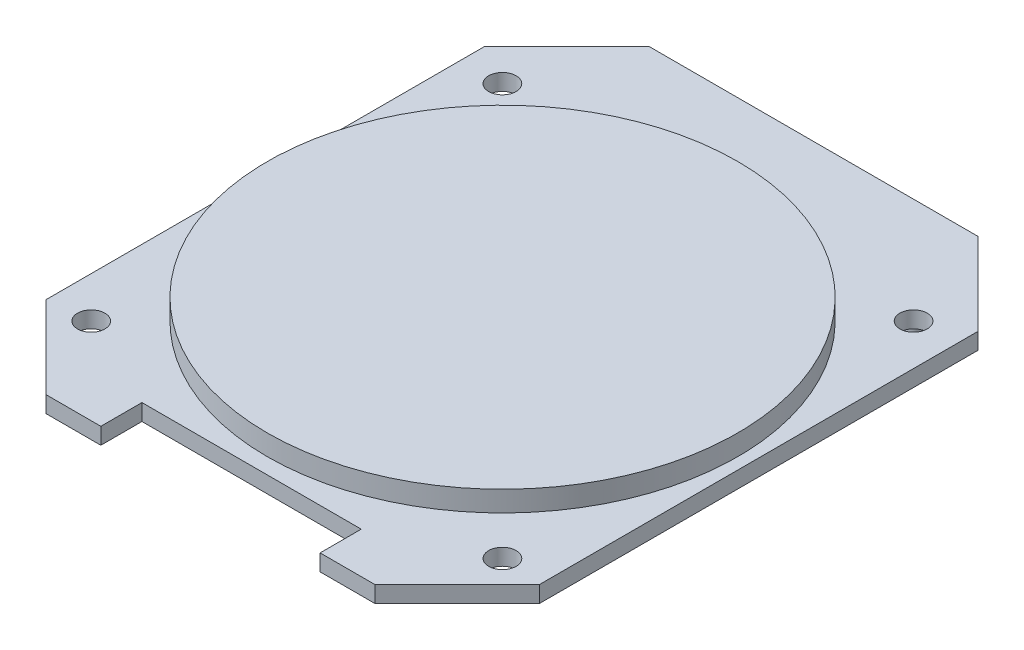
ISO-10303-21;
HEADER;
FILE_DESCRIPTION(('STEP AP214'),'2;1');
FILE_NAME('part.step','',(''),(''),'','','');
FILE_SCHEMA(('AUTOMOTIVE_DESIGN { 1 0 10303 214 1 1 1 1 }'));
ENDSEC;
DATA;
#1=APPLICATION_CONTEXT('core data for automotive mechanical design processes');
#2=APPLICATION_PROTOCOL_DEFINITION('international standard','automotive_design',2000,#1);
#3=PRODUCT_CONTEXT('',#1,'mechanical');
#4=PRODUCT('Part','Part','',(#3));
#5=PRODUCT_RELATED_PRODUCT_CATEGORY('part','',(#4));
#6=PRODUCT_DEFINITION_FORMATION('','',#4);
#7=PRODUCT_DEFINITION_CONTEXT('part definition',#1,'design');
#8=PRODUCT_DEFINITION('design','',#6,#7);
#9=PRODUCT_DEFINITION_SHAPE('','',#8);
#10=(LENGTH_UNIT() NAMED_UNIT(*) SI_UNIT(.MILLI.,.METRE.));
#11=(NAMED_UNIT(*) PLANE_ANGLE_UNIT() SI_UNIT($,.RADIAN.));
#12=(NAMED_UNIT(*) SI_UNIT($,.STERADIAN.) SOLID_ANGLE_UNIT());
#13=UNCERTAINTY_MEASURE_WITH_UNIT(LENGTH_MEASURE(1.E-05),#10,'distance_accuracy_value','');
#14=(GEOMETRIC_REPRESENTATION_CONTEXT(3) GLOBAL_UNCERTAINTY_ASSIGNED_CONTEXT((#13)) GLOBAL_UNIT_ASSIGNED_CONTEXT((#10,
#11,#12)) REPRESENTATION_CONTEXT('',''));
#15=CARTESIAN_POINT('',(0.,0.,0.));
#16=DIRECTION('',(0.,0.,1.));
#17=DIRECTION('',(1.,0.,0.));
#18=AXIS2_PLACEMENT_3D('',#15,#16,#17);
#19=CARTESIAN_POINT('',(0.,0.,0.));
#20=DIRECTION('',(0.,-1.,0.));
#21=DIRECTION('',(0.,0.,-1.));
#22=AXIS2_PLACEMENT_3D('',#19,#20,#21);
#23=PLANE('',#22);
#24=CARTESIAN_POINT('',(-15.,0.,-6.3));
#25=DIRECTION('',(0.,1.,0.));
#26=DIRECTION('',(0.,0.,-1.));
#27=AXIS2_PLACEMENT_3D('',#24,#25,#26);
#28=CIRCLE('',#27,1.00000000000001);
#29=CARTESIAN_POINT('',(-15.,0.,-7.30000000000001));
#30=VERTEX_POINT('',#29);
#31=EDGE_CURVE('E240',#30,#30,#28,.T.);
#32=ORIENTED_EDGE('',*,*,#31,.T.);
#33=EDGE_LOOP('',(#32));
#34=FACE_BOUND('',#33,.T.);
#35=CARTESIAN_POINT('',(15.,0.,-6.3));
#36=DIRECTION('',(0.,1.,0.));
#37=DIRECTION('',(0.,0.,1.));
#38=AXIS2_PLACEMENT_3D('',#35,#36,#37);
#39=CIRCLE('',#38,1.00000000000001);
#40=CARTESIAN_POINT('',(15.,0.,-5.29999999999999));
#41=VERTEX_POINT('',#40);
#42=EDGE_CURVE('E252',#41,#41,#39,.T.);
#43=ORIENTED_EDGE('',*,*,#42,.T.);
#44=EDGE_LOOP('',(#43));
#45=FACE_BOUND('',#44,.T.);
#46=CARTESIAN_POINT('',(15.,0.,-36.3));
#47=DIRECTION('',(0.,1.,0.));
#48=DIRECTION('',(0.,0.,-1.));
#49=AXIS2_PLACEMENT_3D('',#46,#47,#48);
#50=CIRCLE('',#49,1.00000000000001);
#51=CARTESIAN_POINT('',(15.,0.,-37.3));
#52=VERTEX_POINT('',#51);
#53=EDGE_CURVE('E246',#52,#52,#50,.T.);
#54=ORIENTED_EDGE('',*,*,#53,.T.);
#55=EDGE_LOOP('',(#54));
#56=FACE_BOUND('',#55,.T.);
#57=CARTESIAN_POINT('',(-15.,0.,-36.3));
#58=DIRECTION('',(0.,1.,0.));
#59=DIRECTION('',(0.,0.,1.));
#60=AXIS2_PLACEMENT_3D('',#57,#58,#59);
#61=CIRCLE('',#60,1.00000000000001);
#62=CARTESIAN_POINT('',(-15.,0.,-35.3));
#63=VERTEX_POINT('',#62);
#64=EDGE_CURVE('E231',#63,#63,#61,.T.);
#65=ORIENTED_EDGE('',*,*,#64,.T.);
#66=EDGE_LOOP('',(#65));
#67=FACE_BOUND('',#66,.T.);
#68=DIRECTION('',(-1.,0.,0.));
#69=VECTOR('',#68,1.);
#70=CARTESIAN_POINT('',(6.,0.,-28.));
#71=LINE('',#70,#69);
#72=CARTESIAN_POINT('',(6.,0.,-28.));
#73=VERTEX_POINT('',#72);
#74=CARTESIAN_POINT('',(-6.,0.,-28.));
#75=VERTEX_POINT('',#74);
#76=EDGE_CURVE('E199',#73,#75,#71,.T.);
#77=ORIENTED_EDGE('',*,*,#76,.F.);
#78=DIRECTION('',(0.,0.,1.));
#79=VECTOR('',#78,1.);
#80=CARTESIAN_POINT('',(6.,0.,-32.5));
#81=LINE('',#80,#79);
#82=CARTESIAN_POINT('',(6.,0.,-32.5));
#83=VERTEX_POINT('',#82);
#84=EDGE_CURVE('E196',#83,#73,#81,.T.);
#85=ORIENTED_EDGE('',*,*,#84,.F.);
#86=DIRECTION('',(1.,0.,0.));
#87=VECTOR('',#86,1.);
#88=CARTESIAN_POINT('',(6.,0.,-32.5));
#89=LINE('',#88,#87);
#90=CARTESIAN_POINT('',(-6.,0.,-32.5));
#91=VERTEX_POINT('',#90);
#92=EDGE_CURVE('E209',#91,#83,#89,.T.);
#93=ORIENTED_EDGE('',*,*,#92,.F.);
#94=DIRECTION('',(0.,0.,-1.));
#95=VECTOR('',#94,1.);
#96=CARTESIAN_POINT('',(-6.,0.,-32.5));
#97=LINE('',#96,#95);
#98=EDGE_CURVE('E217',#75,#91,#97,.T.);
#99=ORIENTED_EDGE('',*,*,#98,.F.);
#100=EDGE_LOOP('',(#77,#85,#93,#99));
#101=FACE_BOUND('',#100,.T.);
#102=DIRECTION('',(-1.,0.,0.));
#103=VECTOR('',#102,1.);
#104=CARTESIAN_POINT('',(-12.,0.,-44.));
#105=LINE('',#104,#103);
#106=CARTESIAN_POINT('',(-11.43,0.,-44.));
#107=VERTEX_POINT('',#106);
#108=CARTESIAN_POINT('',(-12.,0.,-44.));
#109=VERTEX_POINT('',#108);
#110=EDGE_CURVE('E290',#107,#109,#105,.T.);
#111=ORIENTED_EDGE('',*,*,#110,.F.);
#112=DIRECTION('',(0.,0.,-1.));
#113=VECTOR('',#112,1.);
#114=CARTESIAN_POINT('',(-11.43,0.,-44.));
#115=LINE('',#114,#113);
#116=CARTESIAN_POINT('',(-11.43,0.,-41.46));
#117=VERTEX_POINT('',#116);
#118=EDGE_CURVE('E463',#117,#107,#115,.T.);
#119=ORIENTED_EDGE('',*,*,#118,.F.);
#120=DIRECTION('',(-1.,0.,0.));
#121=VECTOR('',#120,1.);
#122=CARTESIAN_POINT('',(11.43,0.,-41.46));
#123=LINE('',#122,#121);
#124=CARTESIAN_POINT('',(11.43,0.,-41.46));
#125=VERTEX_POINT('',#124);
#126=EDGE_CURVE('E194',#125,#117,#123,.T.);
#127=ORIENTED_EDGE('',*,*,#126,.F.);
#128=DIRECTION('',(0.,0.,1.));
#129=VECTOR('',#128,1.);
#130=CARTESIAN_POINT('',(11.43,0.,-44.));
#131=LINE('',#130,#129);
#132=CARTESIAN_POINT('',(11.43,0.,-44.));
#133=VERTEX_POINT('',#132);
#134=EDGE_CURVE('E190',#133,#125,#131,.T.);
#135=ORIENTED_EDGE('',*,*,#134,.F.);
#136=CARTESIAN_POINT('',(12.,0.,-44.));
#137=VERTEX_POINT('',#136);
#138=EDGE_CURVE('E291',#137,#133,#105,.T.);
#139=ORIENTED_EDGE('',*,*,#138,.F.);
#140=DIRECTION('',(-0.707106781186544,0.,-0.707106781186551));
#141=VECTOR('',#140,1.);
#142=CARTESIAN_POINT('',(12.,0.,-44.));
#143=LINE('',#142,#141);
#144=CARTESIAN_POINT('',(18.,0.,-37.9999999999999));
#145=VERTEX_POINT('',#144);
#146=EDGE_CURVE('E258',#145,#137,#143,.T.);
#147=ORIENTED_EDGE('',*,*,#146,.F.);
#148=DIRECTION('',(0.,0.,-1.));
#149=VECTOR('',#148,1.);
#150=CARTESIAN_POINT('',(18.,0.,-37.9999999999999));
#151=LINE('',#150,#149);
#152=CARTESIAN_POINT('',(18.,0.,-6.00000000000006));
#153=VERTEX_POINT('',#152);
#154=EDGE_CURVE('E265',#153,#145,#151,.T.);
#155=ORIENTED_EDGE('',*,*,#154,.F.);
#156=DIRECTION('',(0.707106781186544,0.,-0.707106781186551));
#157=VECTOR('',#156,1.);
#158=CARTESIAN_POINT('',(18.,0.,-6.00000000000006));
#159=LINE('',#158,#157);
#160=CARTESIAN_POINT('',(12.,0.,0.));
#161=VERTEX_POINT('',#160);
#162=EDGE_CURVE('E310',#161,#153,#159,.T.);
#163=ORIENTED_EDGE('',*,*,#162,.F.);
#164=DIRECTION('',(1.,0.,0.));
#165=VECTOR('',#164,1.);
#166=CARTESIAN_POINT('',(12.,0.,0.));
#167=LINE('',#166,#165);
#168=CARTESIAN_POINT('',(8.,0.,0.));
#169=VERTEX_POINT('',#168);
#170=EDGE_CURVE('E308',#169,#161,#167,.T.);
#171=ORIENTED_EDGE('',*,*,#170,.F.);
#172=DIRECTION('',(0.,0.,1.));
#173=VECTOR('',#172,1.);
#174=CARTESIAN_POINT('',(8.,0.,0.));
#175=LINE('',#174,#173);
#176=CARTESIAN_POINT('',(8.,0.,-3.));
#177=VERTEX_POINT('',#176);
#178=EDGE_CURVE('E306',#177,#169,#175,.T.);
#179=ORIENTED_EDGE('',*,*,#178,.F.);
#180=DIRECTION('',(1.,0.,0.));
#181=VECTOR('',#180,1.);
#182=CARTESIAN_POINT('',(8.,0.,-3.));
#183=LINE('',#182,#181);
#184=CARTESIAN_POINT('',(-8.,0.,-3.));
#185=VERTEX_POINT('',#184);
#186=EDGE_CURVE('E304',#185,#177,#183,.T.);
#187=ORIENTED_EDGE('',*,*,#186,.F.);
#188=DIRECTION('',(0.,0.,-1.));
#189=VECTOR('',#188,1.);
#190=CARTESIAN_POINT('',(-8.,0.,0.));
#191=LINE('',#190,#189);
#192=CARTESIAN_POINT('',(-8.,0.,0.));
#193=VERTEX_POINT('',#192);
#194=EDGE_CURVE('E302',#193,#185,#191,.T.);
#195=ORIENTED_EDGE('',*,*,#194,.F.);
#196=DIRECTION('',(1.,0.,0.));
#197=VECTOR('',#196,1.);
#198=CARTESIAN_POINT('',(-12.,0.,0.));
#199=LINE('',#198,#197);
#200=CARTESIAN_POINT('',(-12.,0.,0.));
#201=VERTEX_POINT('',#200);
#202=EDGE_CURVE('E300',#201,#193,#199,.T.);
#203=ORIENTED_EDGE('',*,*,#202,.F.);
#204=DIRECTION('',(0.707106781186544,0.,0.707106781186551));
#205=VECTOR('',#204,1.);
#206=CARTESIAN_POINT('',(-18.,0.,-6.00000000000007));
#207=LINE('',#206,#205);
#208=CARTESIAN_POINT('',(-18.,0.,-6.00000000000007));
#209=VERTEX_POINT('',#208);
#210=EDGE_CURVE('E298',#209,#201,#207,.T.);
#211=ORIENTED_EDGE('',*,*,#210,.F.);
#212=DIRECTION('',(0.,0.,1.));
#213=VECTOR('',#212,1.);
#214=CARTESIAN_POINT('',(-18.,0.,-37.9999999999999));
#215=LINE('',#214,#213);
#216=CARTESIAN_POINT('',(-18.,0.,-37.9999999999999));
#217=VERTEX_POINT('',#216);
#218=EDGE_CURVE('E296',#217,#209,#215,.T.);
#219=ORIENTED_EDGE('',*,*,#218,.F.);
#220=DIRECTION('',(-0.707106781186544,0.,0.707106781186551));
#221=VECTOR('',#220,1.);
#222=CARTESIAN_POINT('',(-12.,0.,-44.));
#223=LINE('',#222,#221);
#224=EDGE_CURVE('E294',#109,#217,#223,.T.);
#225=ORIENTED_EDGE('',*,*,#224,.F.);
#226=EDGE_LOOP('',(#111,#119,#127,#135,#139,#147,#155,#163,#171,#179,#187,#195,#203,#211,#219,#225));
#227=FACE_BOUND('',#226,.T.);
#228=ADVANCED_FACE('F36',(#34,#45,#56,#67,#101,#227),#23,.T.);
#229=CARTESIAN_POINT('',(0.,1.2,0.));
#230=DIRECTION('',(0.,-1.,0.));
#231=DIRECTION('',(0.,0.,-1.));
#232=AXIS2_PLACEMENT_3D('',#229,#230,#231);
#233=PLANE('',#232);
#234=CARTESIAN_POINT('',(0.,1.2,-21.31));
#235=DIRECTION('',(0.,1.,0.));
#236=DIRECTION('',(0.,0.,1.));
#237=AXIS2_PLACEMENT_3D('',#234,#235,#236);
#238=CIRCLE('',#237,17.16);
#239=CARTESIAN_POINT('',(0.,1.2,-4.14999999999999));
#240=VERTEX_POINT('',#239);
#241=EDGE_CURVE('E232',#240,#240,#238,.T.);
#242=ORIENTED_EDGE('',*,*,#241,.F.);
#243=EDGE_LOOP('',(#242));
#244=FACE_BOUND('',#243,.T.);
#245=DIRECTION('',(-0.707106781186544,0.,-0.707106781186551));
#246=VECTOR('',#245,1.);
#247=CARTESIAN_POINT('',(12.,1.2,-44.));
#248=LINE('',#247,#246);
#249=CARTESIAN_POINT('',(18.,1.2,-37.9999999999999));
#250=VERTEX_POINT('',#249);
#251=CARTESIAN_POINT('',(12.,1.2,-44.));
#252=VERTEX_POINT('',#251);
#253=EDGE_CURVE('E261',#250,#252,#248,.T.);
#254=ORIENTED_EDGE('',*,*,#253,.T.);
#255=DIRECTION('',(-1.,0.,0.));
#256=VECTOR('',#255,1.);
#257=CARTESIAN_POINT('',(-12.,1.2,-44.));
#258=LINE('',#257,#256);
#259=CARTESIAN_POINT('',(-12.,1.2,-44.));
#260=VERTEX_POINT('',#259);
#261=EDGE_CURVE('E264',#252,#260,#258,.T.);
#262=ORIENTED_EDGE('',*,*,#261,.T.);
#263=DIRECTION('',(-0.707106781186544,0.,0.707106781186551));
#264=VECTOR('',#263,1.);
#265=CARTESIAN_POINT('',(-12.,1.2,-44.));
#266=LINE('',#265,#264);
#267=CARTESIAN_POINT('',(-18.,1.2,-37.9999999999999));
#268=VERTEX_POINT('',#267);
#269=EDGE_CURVE('E267',#260,#268,#266,.T.);
#270=ORIENTED_EDGE('',*,*,#269,.T.);
#271=DIRECTION('',(0.,0.,1.));
#272=VECTOR('',#271,1.);
#273=CARTESIAN_POINT('',(-18.,1.2,-37.9999999999999));
#274=LINE('',#273,#272);
#275=CARTESIAN_POINT('',(-18.,1.2,-6.00000000000007));
#276=VERTEX_POINT('',#275);
#277=EDGE_CURVE('E269',#268,#276,#274,.T.);
#278=ORIENTED_EDGE('',*,*,#277,.T.);
#279=DIRECTION('',(0.707106781186544,0.,0.707106781186551));
#280=VECTOR('',#279,1.);
#281=CARTESIAN_POINT('',(-18.,1.2,-6.00000000000007));
#282=LINE('',#281,#280);
#283=CARTESIAN_POINT('',(-12.,1.2,0.));
#284=VERTEX_POINT('',#283);
#285=EDGE_CURVE('E271',#276,#284,#282,.T.);
#286=ORIENTED_EDGE('',*,*,#285,.T.);
#287=DIRECTION('',(1.,0.,0.));
#288=VECTOR('',#287,1.);
#289=CARTESIAN_POINT('',(-12.,1.2,0.));
#290=LINE('',#289,#288);
#291=CARTESIAN_POINT('',(-8.,1.2,0.));
#292=VERTEX_POINT('',#291);
#293=EDGE_CURVE('E273',#284,#292,#290,.T.);
#294=ORIENTED_EDGE('',*,*,#293,.T.);
#295=DIRECTION('',(0.,0.,-1.));
#296=VECTOR('',#295,1.);
#297=CARTESIAN_POINT('',(-8.,1.2,0.));
#298=LINE('',#297,#296);
#299=CARTESIAN_POINT('',(-8.,1.2,-3.));
#300=VERTEX_POINT('',#299);
#301=EDGE_CURVE('E275',#292,#300,#298,.T.);
#302=ORIENTED_EDGE('',*,*,#301,.T.);
#303=DIRECTION('',(1.,0.,0.));
#304=VECTOR('',#303,1.);
#305=CARTESIAN_POINT('',(8.,1.2,-3.));
#306=LINE('',#305,#304);
#307=CARTESIAN_POINT('',(8.,1.2,-3.));
#308=VERTEX_POINT('',#307);
#309=EDGE_CURVE('E277',#300,#308,#306,.T.);
#310=ORIENTED_EDGE('',*,*,#309,.T.);
#311=DIRECTION('',(0.,0.,1.));
#312=VECTOR('',#311,1.);
#313=CARTESIAN_POINT('',(8.,1.2,0.));
#314=LINE('',#313,#312);
#315=CARTESIAN_POINT('',(8.,1.2,0.));
#316=VERTEX_POINT('',#315);
#317=EDGE_CURVE('E279',#308,#316,#314,.T.);
#318=ORIENTED_EDGE('',*,*,#317,.T.);
#319=DIRECTION('',(1.,0.,0.));
#320=VECTOR('',#319,1.);
#321=CARTESIAN_POINT('',(12.,1.2,0.));
#322=LINE('',#321,#320);
#323=CARTESIAN_POINT('',(12.,1.2,0.));
#324=VERTEX_POINT('',#323);
#325=EDGE_CURVE('E281',#316,#324,#322,.T.);
#326=ORIENTED_EDGE('',*,*,#325,.T.);
#327=DIRECTION('',(0.707106781186544,0.,-0.707106781186551));
#328=VECTOR('',#327,1.);
#329=CARTESIAN_POINT('',(18.,1.2,-6.00000000000006));
#330=LINE('',#329,#328);
#331=CARTESIAN_POINT('',(18.,1.2,-6.00000000000006));
#332=VERTEX_POINT('',#331);
#333=EDGE_CURVE('E283',#324,#332,#330,.T.);
#334=ORIENTED_EDGE('',*,*,#333,.T.);
#335=DIRECTION('',(0.,0.,-1.));
#336=VECTOR('',#335,1.);
#337=CARTESIAN_POINT('',(18.,1.2,-37.9999999999999));
#338=LINE('',#337,#336);
#339=EDGE_CURVE('E285',#332,#250,#338,.T.);
#340=ORIENTED_EDGE('',*,*,#339,.T.);
#341=EDGE_LOOP('',(#254,#262,#270,#278,#286,#294,#302,#310,#318,#326,#334,#340));
#342=FACE_BOUND('',#341,.T.);
#343=CARTESIAN_POINT('',(15.,1.2,-6.3));
#344=DIRECTION('',(0.,1.,0.));
#345=DIRECTION('',(0.,0.,1.));
#346=AXIS2_PLACEMENT_3D('',#343,#344,#345);
#347=CIRCLE('',#346,1.00000000000001);
#348=CARTESIAN_POINT('',(15.,1.2,-5.29999999999999));
#349=VERTEX_POINT('',#348);
#350=EDGE_CURVE('E255',#349,#349,#347,.T.);
#351=ORIENTED_EDGE('',*,*,#350,.F.);
#352=EDGE_LOOP('',(#351));
#353=FACE_BOUND('',#352,.T.);
#354=CARTESIAN_POINT('',(15.,1.2,-36.3));
#355=DIRECTION('',(0.,1.,0.));
#356=DIRECTION('',(0.,0.,-1.));
#357=AXIS2_PLACEMENT_3D('',#354,#355,#356);
#358=CIRCLE('',#357,1.00000000000001);
#359=CARTESIAN_POINT('',(15.,1.2,-37.3));
#360=VERTEX_POINT('',#359);
#361=EDGE_CURVE('E249',#360,#360,#358,.T.);
#362=ORIENTED_EDGE('',*,*,#361,.F.);
#363=EDGE_LOOP('',(#362));
#364=FACE_BOUND('',#363,.T.);
#365=CARTESIAN_POINT('',(-15.,1.2,-6.3));
#366=DIRECTION('',(0.,1.,0.));
#367=DIRECTION('',(0.,0.,-1.));
#368=AXIS2_PLACEMENT_3D('',#365,#366,#367);
#369=CIRCLE('',#368,1.00000000000001);
#370=CARTESIAN_POINT('',(-15.,1.2,-7.30000000000001));
#371=VERTEX_POINT('',#370);
#372=EDGE_CURVE('E243',#371,#371,#369,.T.);
#373=ORIENTED_EDGE('',*,*,#372,.F.);
#374=EDGE_LOOP('',(#373));
#375=FACE_BOUND('',#374,.T.);
#376=CARTESIAN_POINT('',(-15.,1.2,-36.3));
#377=DIRECTION('',(0.,1.,0.));
#378=DIRECTION('',(0.,0.,1.));
#379=AXIS2_PLACEMENT_3D('',#376,#377,#378);
#380=CIRCLE('',#379,1.00000000000001);
#381=CARTESIAN_POINT('',(-15.,1.2,-35.3));
#382=VERTEX_POINT('',#381);
#383=EDGE_CURVE('E237',#382,#382,#380,.T.);
#384=ORIENTED_EDGE('',*,*,#383,.F.);
#385=EDGE_LOOP('',(#384));
#386=FACE_BOUND('',#385,.T.);
#387=ADVANCED_FACE('F398',(#244,#342,#353,#364,#375,#386),#233,.F.);
#388=CARTESIAN_POINT('',(12.,1.2,-44.));
#389=DIRECTION('',(-0.707106781186551,0.,0.707106781186544));
#390=DIRECTION('',(0.707106781186544,0.,0.707106781186551));
#391=AXIS2_PLACEMENT_3D('',#388,#389,#390);
#392=PLANE('',#391);
#393=ORIENTED_EDGE('',*,*,#146,.T.);
#394=DIRECTION('',(0.,-1.,0.));
#395=VECTOR('',#394,1.);
#396=CARTESIAN_POINT('',(12.,1.2,-44.));
#397=LINE('',#396,#395);
#398=EDGE_CURVE('E236',#252,#137,#397,.T.);
#399=ORIENTED_EDGE('',*,*,#398,.F.);
#400=ORIENTED_EDGE('',*,*,#253,.F.);
#401=DIRECTION('',(0.,-1.,0.));
#402=VECTOR('',#401,1.);
#403=CARTESIAN_POINT('',(18.,1.2,-37.9999999999999));
#404=LINE('',#403,#402);
#405=EDGE_CURVE('E287',#250,#145,#404,.T.);
#406=ORIENTED_EDGE('',*,*,#405,.T.);
#407=EDGE_LOOP('',(#393,#399,#400,#406));
#408=FACE_BOUND('',#407,.T.);
#409=ADVANCED_FACE('F38',(#408),#392,.F.);
#410=CARTESIAN_POINT('',(-12.,1.2,-44.));
#411=DIRECTION('',(0.,0.,1.));
#412=DIRECTION('',(1.,0.,0.));
#413=AXIS2_PLACEMENT_3D('',#410,#411,#412);
#414=PLANE('',#413);
#415=ORIENTED_EDGE('',*,*,#138,.T.);
#416=DIRECTION('',(0.,1.,0.));
#417=VECTOR('',#416,1.);
#418=CARTESIAN_POINT('',(11.43,-2.,-44.));
#419=LINE('',#418,#417);
#420=CARTESIAN_POINT('',(11.43,-2.,-44.));
#421=VERTEX_POINT('',#420);
#422=EDGE_CURVE('E201',#421,#133,#419,.T.);
#423=ORIENTED_EDGE('',*,*,#422,.F.);
#424=DIRECTION('',(1.,0.,0.));
#425=VECTOR('',#424,1.);
#426=CARTESIAN_POINT('',(11.43,-2.,-44.));
#427=LINE('',#426,#425);
#428=CARTESIAN_POINT('',(-11.43,-2.,-44.));
#429=VERTEX_POINT('',#428);
#430=EDGE_CURVE('E180',#429,#421,#427,.T.);
#431=ORIENTED_EDGE('',*,*,#430,.F.);
#432=DIRECTION('',(0.,1.,0.));
#433=VECTOR('',#432,1.);
#434=CARTESIAN_POINT('',(-11.43,-2.,-44.));
#435=LINE('',#434,#433);
#436=EDGE_CURVE('E51',#429,#107,#435,.T.);
#437=ORIENTED_EDGE('',*,*,#436,.T.);
#438=ORIENTED_EDGE('',*,*,#110,.T.);
#439=DIRECTION('',(0.,-1.,0.));
#440=VECTOR('',#439,1.);
#441=CARTESIAN_POINT('',(-12.,1.2,-44.));
#442=LINE('',#441,#440);
#443=EDGE_CURVE('E342',#260,#109,#442,.T.);
#444=ORIENTED_EDGE('',*,*,#443,.F.);
#445=ORIENTED_EDGE('',*,*,#261,.F.);
#446=ORIENTED_EDGE('',*,*,#398,.T.);
#447=EDGE_LOOP('',(#415,#423,#431,#437,#438,#444,#445,#446));
#448=FACE_BOUND('',#447,.T.);
#449=ADVANCED_FACE('F448',(#448),#414,.F.);
#450=CARTESIAN_POINT('',(-12.,1.2,-44.));
#451=DIRECTION('',(0.707106781186551,0.,0.707106781186544));
#452=DIRECTION('',(0.707106781186544,0.,-0.707106781186551));
#453=AXIS2_PLACEMENT_3D('',#450,#451,#452);
#454=PLANE('',#453);
#455=ORIENTED_EDGE('',*,*,#224,.T.);
#456=DIRECTION('',(0.,-1.,0.));
#457=VECTOR('',#456,1.);
#458=CARTESIAN_POINT('',(-18.,1.2,-37.9999999999999));
#459=LINE('',#458,#457);
#460=EDGE_CURVE('E339',#268,#217,#459,.T.);
#461=ORIENTED_EDGE('',*,*,#460,.F.);
#462=ORIENTED_EDGE('',*,*,#269,.F.);
#463=ORIENTED_EDGE('',*,*,#443,.T.);
#464=EDGE_LOOP('',(#455,#461,#462,#463));
#465=FACE_BOUND('',#464,.T.);
#466=ADVANCED_FACE('F445',(#465),#454,.F.);
#467=CARTESIAN_POINT('',(-18.,1.2,-37.9999999999999));
#468=DIRECTION('',(1.,0.,0.));
#469=DIRECTION('',(0.,0.,-1.));
#470=AXIS2_PLACEMENT_3D('',#467,#468,#469);
#471=PLANE('',#470);
#472=ORIENTED_EDGE('',*,*,#218,.T.);
#473=DIRECTION('',(0.,-1.,0.));
#474=VECTOR('',#473,1.);
#475=CARTESIAN_POINT('',(-18.,1.2,-6.00000000000007));
#476=LINE('',#475,#474);
#477=EDGE_CURVE('E336',#276,#209,#476,.T.);
#478=ORIENTED_EDGE('',*,*,#477,.F.);
#479=ORIENTED_EDGE('',*,*,#277,.F.);
#480=ORIENTED_EDGE('',*,*,#460,.T.);
#481=EDGE_LOOP('',(#472,#478,#479,#480));
#482=FACE_BOUND('',#481,.T.);
#483=ADVANCED_FACE('F441',(#482),#471,.F.);
#484=CARTESIAN_POINT('',(-18.,1.2,-6.00000000000007));
#485=DIRECTION('',(0.707106781186551,0.,-0.707106781186544));
#486=DIRECTION('',(-0.707106781186544,0.,-0.707106781186551));
#487=AXIS2_PLACEMENT_3D('',#484,#485,#486);
#488=PLANE('',#487);
#489=ORIENTED_EDGE('',*,*,#210,.T.);
#490=DIRECTION('',(0.,-1.,0.));
#491=VECTOR('',#490,1.);
#492=CARTESIAN_POINT('',(-12.,1.2,0.));
#493=LINE('',#492,#491);
#494=EDGE_CURVE('E333',#284,#201,#493,.T.);
#495=ORIENTED_EDGE('',*,*,#494,.F.);
#496=ORIENTED_EDGE('',*,*,#285,.F.);
#497=ORIENTED_EDGE('',*,*,#477,.T.);
#498=EDGE_LOOP('',(#489,#495,#496,#497));
#499=FACE_BOUND('',#498,.T.);
#500=ADVANCED_FACE('F437',(#499),#488,.F.);
#501=CARTESIAN_POINT('',(-12.,1.2,0.));
#502=DIRECTION('',(0.,0.,-1.));
#503=DIRECTION('',(-1.,0.,0.));
#504=AXIS2_PLACEMENT_3D('',#501,#502,#503);
#505=PLANE('',#504);
#506=ORIENTED_EDGE('',*,*,#202,.T.);
#507=DIRECTION('',(0.,-1.,0.));
#508=VECTOR('',#507,1.);
#509=CARTESIAN_POINT('',(-8.,1.2,0.));
#510=LINE('',#509,#508);
#511=EDGE_CURVE('E330',#292,#193,#510,.T.);
#512=ORIENTED_EDGE('',*,*,#511,.F.);
#513=ORIENTED_EDGE('',*,*,#293,.F.);
#514=ORIENTED_EDGE('',*,*,#494,.T.);
#515=EDGE_LOOP('',(#506,#512,#513,#514));
#516=FACE_BOUND('',#515,.T.);
#517=ADVANCED_FACE('F433',(#516),#505,.F.);
#518=CARTESIAN_POINT('',(-8.,1.2,0.));
#519=DIRECTION('',(-1.,0.,0.));
#520=DIRECTION('',(0.,0.,1.));
#521=AXIS2_PLACEMENT_3D('',#518,#519,#520);
#522=PLANE('',#521);
#523=ORIENTED_EDGE('',*,*,#194,.T.);
#524=DIRECTION('',(0.,-1.,0.));
#525=VECTOR('',#524,1.);
#526=CARTESIAN_POINT('',(-8.,1.2,-3.));
#527=LINE('',#526,#525);
#528=EDGE_CURVE('E327',#300,#185,#527,.T.);
#529=ORIENTED_EDGE('',*,*,#528,.F.);
#530=ORIENTED_EDGE('',*,*,#301,.F.);
#531=ORIENTED_EDGE('',*,*,#511,.T.);
#532=EDGE_LOOP('',(#523,#529,#530,#531));
#533=FACE_BOUND('',#532,.T.);
#534=ADVANCED_FACE('F429',(#533),#522,.F.);
#535=CARTESIAN_POINT('',(8.,1.2,-3.));
#536=DIRECTION('',(0.,0.,-1.));
#537=DIRECTION('',(-1.,0.,0.));
#538=AXIS2_PLACEMENT_3D('',#535,#536,#537);
#539=PLANE('',#538);
#540=ORIENTED_EDGE('',*,*,#186,.T.);
#541=DIRECTION('',(0.,-1.,0.));
#542=VECTOR('',#541,1.);
#543=CARTESIAN_POINT('',(8.,1.2,-3.));
#544=LINE('',#543,#542);
#545=EDGE_CURVE('E324',#308,#177,#544,.T.);
#546=ORIENTED_EDGE('',*,*,#545,.F.);
#547=ORIENTED_EDGE('',*,*,#309,.F.);
#548=ORIENTED_EDGE('',*,*,#528,.T.);
#549=EDGE_LOOP('',(#540,#546,#547,#548));
#550=FACE_BOUND('',#549,.T.);
#551=ADVANCED_FACE('F425',(#550),#539,.F.);
#552=CARTESIAN_POINT('',(8.,1.2,0.));
#553=DIRECTION('',(1.,0.,0.));
#554=DIRECTION('',(0.,0.,-1.));
#555=AXIS2_PLACEMENT_3D('',#552,#553,#554);
#556=PLANE('',#555);
#557=ORIENTED_EDGE('',*,*,#178,.T.);
#558=DIRECTION('',(0.,-1.,0.));
#559=VECTOR('',#558,1.);
#560=CARTESIAN_POINT('',(8.,1.2,0.));
#561=LINE('',#560,#559);
#562=EDGE_CURVE('E321',#316,#169,#561,.T.);
#563=ORIENTED_EDGE('',*,*,#562,.F.);
#564=ORIENTED_EDGE('',*,*,#317,.F.);
#565=ORIENTED_EDGE('',*,*,#545,.T.);
#566=EDGE_LOOP('',(#557,#563,#564,#565));
#567=FACE_BOUND('',#566,.T.);
#568=ADVANCED_FACE('F421',(#567),#556,.F.);
#569=CARTESIAN_POINT('',(12.,1.2,0.));
#570=DIRECTION('',(0.,0.,-1.));
#571=DIRECTION('',(-1.,0.,0.));
#572=AXIS2_PLACEMENT_3D('',#569,#570,#571);
#573=PLANE('',#572);
#574=ORIENTED_EDGE('',*,*,#170,.T.);
#575=DIRECTION('',(0.,-1.,0.));
#576=VECTOR('',#575,1.);
#577=CARTESIAN_POINT('',(12.,1.2,0.));
#578=LINE('',#577,#576);
#579=EDGE_CURVE('E318',#324,#161,#578,.T.);
#580=ORIENTED_EDGE('',*,*,#579,.F.);
#581=ORIENTED_EDGE('',*,*,#325,.F.);
#582=ORIENTED_EDGE('',*,*,#562,.T.);
#583=EDGE_LOOP('',(#574,#580,#581,#582));
#584=FACE_BOUND('',#583,.T.);
#585=ADVANCED_FACE('F417',(#584),#573,.F.);
#586=CARTESIAN_POINT('',(18.,1.2,-6.00000000000006));
#587=DIRECTION('',(-0.707106781186551,0.,-0.707106781186544));
#588=DIRECTION('',(-0.707106781186544,0.,0.707106781186551));
#589=AXIS2_PLACEMENT_3D('',#586,#587,#588);
#590=PLANE('',#589);
#591=ORIENTED_EDGE('',*,*,#162,.T.);
#592=DIRECTION('',(0.,-1.,0.));
#593=VECTOR('',#592,1.);
#594=CARTESIAN_POINT('',(18.,1.2,-6.00000000000006));
#595=LINE('',#594,#593);
#596=EDGE_CURVE('E315',#332,#153,#595,.T.);
#597=ORIENTED_EDGE('',*,*,#596,.F.);
#598=ORIENTED_EDGE('',*,*,#333,.F.);
#599=ORIENTED_EDGE('',*,*,#579,.T.);
#600=EDGE_LOOP('',(#591,#597,#598,#599));
#601=FACE_BOUND('',#600,.T.);
#602=ADVANCED_FACE('F413',(#601),#590,.F.);
#603=CARTESIAN_POINT('',(18.,1.2,-37.9999999999999));
#604=DIRECTION('',(-1.,0.,0.));
#605=DIRECTION('',(0.,0.,1.));
#606=AXIS2_PLACEMENT_3D('',#603,#604,#605);
#607=PLANE('',#606);
#608=ORIENTED_EDGE('',*,*,#154,.T.);
#609=ORIENTED_EDGE('',*,*,#405,.F.);
#610=ORIENTED_EDGE('',*,*,#339,.F.);
#611=ORIENTED_EDGE('',*,*,#596,.T.);
#612=EDGE_LOOP('',(#608,#609,#610,#611));
#613=FACE_BOUND('',#612,.T.);
#614=ADVANCED_FACE('F409',(#613),#607,.F.);
#615=CARTESIAN_POINT('',(15.,1.2,-6.3));
#616=DIRECTION('',(0.,-1.,0.));
#617=DIRECTION('',(0.,0.,-1.));
#618=AXIS2_PLACEMENT_3D('',#615,#616,#617);
#619=CYLINDRICAL_SURFACE('',#618,1.00000000000001);
#620=ORIENTED_EDGE('',*,*,#350,.T.);
#621=EDGE_LOOP('',(#620));
#622=FACE_BOUND('',#621,.T.);
#623=ORIENTED_EDGE('',*,*,#42,.F.);
#624=EDGE_LOOP('',(#623));
#625=FACE_BOUND('',#624,.T.);
#626=ADVANCED_FACE('F412',(#622,#625),#619,.F.);
#627=CARTESIAN_POINT('',(15.,1.2,-36.3));
#628=DIRECTION('',(0.,-1.,0.));
#629=DIRECTION('',(0.,0.,-1.));
#630=AXIS2_PLACEMENT_3D('',#627,#628,#629);
#631=CYLINDRICAL_SURFACE('',#630,1.00000000000001);
#632=ORIENTED_EDGE('',*,*,#361,.T.);
#633=EDGE_LOOP('',(#632));
#634=FACE_BOUND('',#633,.T.);
#635=ORIENTED_EDGE('',*,*,#53,.F.);
#636=EDGE_LOOP('',(#635));
#637=FACE_BOUND('',#636,.T.);
#638=ADVANCED_FACE('F767',(#634,#637),#631,.F.);
#639=CARTESIAN_POINT('',(-15.,1.2,-6.3));
#640=DIRECTION('',(0.,-1.,0.));
#641=DIRECTION('',(0.,0.,-1.));
#642=AXIS2_PLACEMENT_3D('',#639,#640,#641);
#643=CYLINDRICAL_SURFACE('',#642,1.00000000000001);
#644=ORIENTED_EDGE('',*,*,#372,.T.);
#645=EDGE_LOOP('',(#644));
#646=FACE_BOUND('',#645,.T.);
#647=ORIENTED_EDGE('',*,*,#31,.F.);
#648=EDGE_LOOP('',(#647));
#649=FACE_BOUND('',#648,.T.);
#650=ADVANCED_FACE('F758',(#646,#649),#643,.F.);
#651=CARTESIAN_POINT('',(-15.,1.2,-36.3));
#652=DIRECTION('',(0.,-1.,0.));
#653=DIRECTION('',(0.,0.,-1.));
#654=AXIS2_PLACEMENT_3D('',#651,#652,#653);
#655=CYLINDRICAL_SURFACE('',#654,1.00000000000001);
#656=ORIENTED_EDGE('',*,*,#383,.T.);
#657=EDGE_LOOP('',(#656));
#658=FACE_BOUND('',#657,.T.);
#659=ORIENTED_EDGE('',*,*,#64,.F.);
#660=EDGE_LOOP('',(#659));
#661=FACE_BOUND('',#660,.T.);
#662=ADVANCED_FACE('F748',(#658,#661),#655,.F.);
#663=CARTESIAN_POINT('',(0.,2.7,-21.31));
#664=DIRECTION('',(0.,-1.,0.));
#665=DIRECTION('',(0.,0.,-1.));
#666=AXIS2_PLACEMENT_3D('',#663,#664,#665);
#667=CYLINDRICAL_SURFACE('',#666,17.16);
#668=CARTESIAN_POINT('',(0.,2.7,-21.31));
#669=DIRECTION('',(0.,1.,0.));
#670=DIRECTION('',(0.,0.,1.));
#671=AXIS2_PLACEMENT_3D('',#668,#669,#670);
#672=CIRCLE('',#671,17.16);
#673=CARTESIAN_POINT('',(0.,2.7,-4.14999999999999));
#674=VERTEX_POINT('',#673);
#675=EDGE_CURVE('E228',#674,#674,#672,.T.);
#676=ORIENTED_EDGE('',*,*,#675,.F.);
#677=EDGE_LOOP('',(#676));
#678=FACE_BOUND('',#677,.T.);
#679=ORIENTED_EDGE('',*,*,#241,.T.);
#680=EDGE_LOOP('',(#679));
#681=FACE_BOUND('',#680,.T.);
#682=ADVANCED_FACE('F738',(#678,#681),#667,.T.);
#683=CARTESIAN_POINT('',(0.,2.7,-21.31));
#684=DIRECTION('',(0.,1.,0.));
#685=DIRECTION('',(0.,0.,1.));
#686=AXIS2_PLACEMENT_3D('',#683,#684,#685);
#687=PLANE('',#686);
#688=ORIENTED_EDGE('',*,*,#675,.T.);
#689=EDGE_LOOP('',(#688));
#690=FACE_BOUND('',#689,.T.);
#691=ADVANCED_FACE('F716',(#690),#687,.T.);
#692=CARTESIAN_POINT('',(6.,-2.,-32.5));
#693=DIRECTION('',(-1.,0.,0.));
#694=DIRECTION('',(0.,0.,1.));
#695=AXIS2_PLACEMENT_3D('',#692,#693,#694);
#696=PLANE('',#695);
#697=ORIENTED_EDGE('',*,*,#84,.T.);
#698=DIRECTION('',(0.,1.,0.));
#699=VECTOR('',#698,1.);
#700=CARTESIAN_POINT('',(6.,-2.,-28.));
#701=LINE('',#700,#699);
#702=CARTESIAN_POINT('',(6.,-2.,-28.));
#703=VERTEX_POINT('',#702);
#704=EDGE_CURVE('E226',#703,#73,#701,.T.);
#705=ORIENTED_EDGE('',*,*,#704,.F.);
#706=DIRECTION('',(0.,0.,1.));
#707=VECTOR('',#706,1.);
#708=CARTESIAN_POINT('',(6.,-2.,-32.5));
#709=LINE('',#708,#707);
#710=CARTESIAN_POINT('',(6.,-2.,-32.5));
#711=VERTEX_POINT('',#710);
#712=EDGE_CURVE('E205',#711,#703,#709,.T.);
#713=ORIENTED_EDGE('',*,*,#712,.F.);
#714=DIRECTION('',(0.,1.,0.));
#715=VECTOR('',#714,1.);
#716=CARTESIAN_POINT('',(6.,-2.,-32.5));
#717=LINE('',#716,#715);
#718=EDGE_CURVE('E214',#711,#83,#717,.T.);
#719=ORIENTED_EDGE('',*,*,#718,.T.);
#720=EDGE_LOOP('',(#697,#705,#713,#719));
#721=FACE_BOUND('',#720,.T.);
#722=ADVANCED_FACE('F707',(#721),#696,.F.);
#723=CARTESIAN_POINT('',(6.,-2.,-28.));
#724=DIRECTION('',(0.,0.,-1.));
#725=DIRECTION('',(-1.,0.,0.));
#726=AXIS2_PLACEMENT_3D('',#723,#724,#725);
#727=PLANE('',#726);
#728=ORIENTED_EDGE('',*,*,#76,.T.);
#729=DIRECTION('',(0.,1.,0.));
#730=VECTOR('',#729,1.);
#731=CARTESIAN_POINT('',(-6.,-2.,-28.));
#732=LINE('',#731,#730);
#733=CARTESIAN_POINT('',(-6.,-2.,-28.));
#734=VERTEX_POINT('',#733);
#735=EDGE_CURVE('E223',#734,#75,#732,.T.);
#736=ORIENTED_EDGE('',*,*,#735,.F.);
#737=DIRECTION('',(-1.,0.,0.));
#738=VECTOR('',#737,1.);
#739=CARTESIAN_POINT('',(6.,-2.,-28.));
#740=LINE('',#739,#738);
#741=EDGE_CURVE('E208',#703,#734,#740,.T.);
#742=ORIENTED_EDGE('',*,*,#741,.F.);
#743=ORIENTED_EDGE('',*,*,#704,.T.);
#744=EDGE_LOOP('',(#728,#736,#742,#743));
#745=FACE_BOUND('',#744,.T.);
#746=ADVANCED_FACE('F698',(#745),#727,.F.);
#747=CARTESIAN_POINT('',(-6.,-2.,-32.5));
#748=DIRECTION('',(1.,0.,0.));
#749=DIRECTION('',(0.,0.,-1.));
#750=AXIS2_PLACEMENT_3D('',#747,#748,#749);
#751=PLANE('',#750);
#752=ORIENTED_EDGE('',*,*,#98,.T.);
#753=DIRECTION('',(0.,1.,0.));
#754=VECTOR('',#753,1.);
#755=CARTESIAN_POINT('',(-6.,-2.,-32.5));
#756=LINE('',#755,#754);
#757=CARTESIAN_POINT('',(-6.,-2.,-32.5));
#758=VERTEX_POINT('',#757);
#759=EDGE_CURVE('E59',#758,#91,#756,.T.);
#760=ORIENTED_EDGE('',*,*,#759,.F.);
#761=DIRECTION('',(0.,0.,-1.));
#762=VECTOR('',#761,1.);
#763=CARTESIAN_POINT('',(-6.,-2.,-32.5));
#764=LINE('',#763,#762);
#765=EDGE_CURVE('E211',#734,#758,#764,.T.);
#766=ORIENTED_EDGE('',*,*,#765,.F.);
#767=ORIENTED_EDGE('',*,*,#735,.T.);
#768=EDGE_LOOP('',(#752,#760,#766,#767));
#769=FACE_BOUND('',#768,.T.);
#770=ADVANCED_FACE('F690',(#769),#751,.F.);
#771=CARTESIAN_POINT('',(6.,-2.,-32.5));
#772=DIRECTION('',(0.,0.,1.));
#773=DIRECTION('',(1.,0.,0.));
#774=AXIS2_PLACEMENT_3D('',#771,#772,#773);
#775=PLANE('',#774);
#776=ORIENTED_EDGE('',*,*,#92,.T.);
#777=ORIENTED_EDGE('',*,*,#718,.F.);
#778=DIRECTION('',(1.,0.,0.));
#779=VECTOR('',#778,1.);
#780=CARTESIAN_POINT('',(6.,-2.,-32.5));
#781=LINE('',#780,#779);
#782=EDGE_CURVE('E213',#758,#711,#781,.T.);
#783=ORIENTED_EDGE('',*,*,#782,.F.);
#784=ORIENTED_EDGE('',*,*,#759,.T.);
#785=EDGE_LOOP('',(#776,#777,#783,#784));
#786=FACE_BOUND('',#785,.T.);
#787=ADVANCED_FACE('F681',(#786),#775,.F.);
#788=CARTESIAN_POINT('',(0.,-2.,0.));
#789=DIRECTION('',(0.,-1.,0.));
#790=DIRECTION('',(0.,0.,-1.));
#791=AXIS2_PLACEMENT_3D('',#788,#789,#790);
#792=PLANE('',#791);
#793=ORIENTED_EDGE('',*,*,#712,.T.);
#794=ORIENTED_EDGE('',*,*,#741,.T.);
#795=ORIENTED_EDGE('',*,*,#765,.T.);
#796=ORIENTED_EDGE('',*,*,#782,.T.);
#797=EDGE_LOOP('',(#793,#794,#795,#796));
#798=FACE_BOUND('',#797,.T.);
#799=ADVANCED_FACE('F673',(#798),#792,.T.);
#800=CARTESIAN_POINT('',(11.43,-2.,-41.46));
#801=DIRECTION('',(0.,0.,-1.));
#802=DIRECTION('',(-1.,0.,0.));
#803=AXIS2_PLACEMENT_3D('',#800,#801,#802);
#804=PLANE('',#803);
#805=ORIENTED_EDGE('',*,*,#126,.T.);
#806=DIRECTION('',(0.,1.,0.));
#807=VECTOR('',#806,1.);
#808=CARTESIAN_POINT('',(-11.43,-2.,-41.46));
#809=LINE('',#808,#807);
#810=CARTESIAN_POINT('',(-11.43,-2.,-41.46));
#811=VERTEX_POINT('',#810);
#812=EDGE_CURVE('E177',#811,#117,#809,.T.);
#813=ORIENTED_EDGE('',*,*,#812,.F.);
#814=DIRECTION('',(-1.,0.,0.));
#815=VECTOR('',#814,1.);
#816=CARTESIAN_POINT('',(11.43,-2.,-41.46));
#817=LINE('',#816,#815);
#818=CARTESIAN_POINT('',(11.43,-2.,-41.46));
#819=VERTEX_POINT('',#818);
#820=EDGE_CURVE('E181',#819,#811,#817,.T.);
#821=ORIENTED_EDGE('',*,*,#820,.F.);
#822=DIRECTION('',(0.,1.,0.));
#823=VECTOR('',#822,1.);
#824=CARTESIAN_POINT('',(11.43,-2.,-41.46));
#825=LINE('',#824,#823);
#826=EDGE_CURVE('E468',#819,#125,#825,.T.);
#827=ORIENTED_EDGE('',*,*,#826,.T.);
#828=EDGE_LOOP('',(#805,#813,#821,#827));
#829=FACE_BOUND('',#828,.T.);
#830=ADVANCED_FACE('F192',(#829),#804,.F.);
#831=CARTESIAN_POINT('',(-11.43,-2.,-44.));
#832=DIRECTION('',(1.,0.,0.));
#833=DIRECTION('',(0.,0.,-1.));
#834=AXIS2_PLACEMENT_3D('',#831,#832,#833);
#835=PLANE('',#834);
#836=ORIENTED_EDGE('',*,*,#118,.T.);
#837=ORIENTED_EDGE('',*,*,#436,.F.);
#838=DIRECTION('',(0.,0.,-1.));
#839=VECTOR('',#838,1.);
#840=CARTESIAN_POINT('',(-11.43,-2.,-44.));
#841=LINE('',#840,#839);
#842=EDGE_CURVE('E173',#811,#429,#841,.T.);
#843=ORIENTED_EDGE('',*,*,#842,.F.);
#844=ORIENTED_EDGE('',*,*,#812,.T.);
#845=EDGE_LOOP('',(#836,#837,#843,#844));
#846=FACE_BOUND('',#845,.T.);
#847=ADVANCED_FACE('F175',(#846),#835,.F.);
#848=CARTESIAN_POINT('',(11.43,-2.,-44.));
#849=DIRECTION('',(-1.,0.,0.));
#850=DIRECTION('',(0.,0.,1.));
#851=AXIS2_PLACEMENT_3D('',#848,#849,#850);
#852=PLANE('',#851);
#853=ORIENTED_EDGE('',*,*,#134,.T.);
#854=ORIENTED_EDGE('',*,*,#826,.F.);
#855=DIRECTION('',(0.,0.,1.));
#856=VECTOR('',#855,1.);
#857=CARTESIAN_POINT('',(11.43,-2.,-44.));
#858=LINE('',#857,#856);
#859=EDGE_CURVE('E186',#421,#819,#858,.T.);
#860=ORIENTED_EDGE('',*,*,#859,.F.);
#861=ORIENTED_EDGE('',*,*,#422,.T.);
#862=EDGE_LOOP('',(#853,#854,#860,#861));
#863=FACE_BOUND('',#862,.T.);
#864=ADVANCED_FACE('F371',(#863),#852,.F.);
#865=CARTESIAN_POINT('',(0.,-2.,0.));
#866=DIRECTION('',(0.,1.,0.));
#867=DIRECTION('',(0.,0.,1.));
#868=AXIS2_PLACEMENT_3D('',#865,#866,#867);
#869=PLANE('',#868);
#870=CARTESIAN_POINT('',(1.27000000000001,-2.,-42.5));
#871=DIRECTION('',(0.,1.,0.));
#872=DIRECTION('',(0.,0.,1.));
#873=AXIS2_PLACEMENT_3D('',#870,#871,#872);
#874=CIRCLE('',#873,0.5);
#875=CARTESIAN_POINT('',(1.27000000000001,-2.,-42.));
#876=VERTEX_POINT('',#875);
#877=EDGE_CURVE('E11',#876,#876,#874,.F.);
#878=ORIENTED_EDGE('',*,*,#877,.F.);
#879=EDGE_LOOP('',(#878));
#880=FACE_BOUND('',#879,.T.);
#881=CARTESIAN_POINT('',(3.81000000000001,-2.,-42.5));
#882=DIRECTION('',(0.,1.,0.));
#883=DIRECTION('',(0.,0.,1.));
#884=AXIS2_PLACEMENT_3D('',#881,#882,#883);
#885=CIRCLE('',#884,0.5);
#886=CARTESIAN_POINT('',(3.81000000000001,-2.,-42.));
#887=VERTEX_POINT('',#886);
#888=EDGE_CURVE('E44',#887,#887,#885,.F.);
#889=ORIENTED_EDGE('',*,*,#888,.F.);
#890=EDGE_LOOP('',(#889));
#891=FACE_BOUND('',#890,.T.);
#892=CARTESIAN_POINT('',(6.35,-2.,-42.5));
#893=DIRECTION('',(0.,1.,0.));
#894=DIRECTION('',(0.,0.,1.));
#895=AXIS2_PLACEMENT_3D('',#892,#893,#894);
#896=CIRCLE('',#895,0.500000000000001);
#897=CARTESIAN_POINT('',(6.35,-2.,-42.));
#898=VERTEX_POINT('',#897);
#899=EDGE_CURVE('E361',#898,#898,#896,.F.);
#900=ORIENTED_EDGE('',*,*,#899,.F.);
#901=EDGE_LOOP('',(#900));
#902=FACE_BOUND('',#901,.T.);
#903=CARTESIAN_POINT('',(8.89000000000001,-2.,-42.5));
#904=DIRECTION('',(0.,1.,0.));
#905=DIRECTION('',(0.,0.,1.));
#906=AXIS2_PLACEMENT_3D('',#903,#904,#905);
#907=CIRCLE('',#906,0.500000000000001);
#908=CARTESIAN_POINT('',(8.89000000000001,-2.,-42.));
#909=VERTEX_POINT('',#908);
#910=EDGE_CURVE('E358',#909,#909,#907,.F.);
#911=ORIENTED_EDGE('',*,*,#910,.F.);
#912=EDGE_LOOP('',(#911));
#913=FACE_BOUND('',#912,.T.);
#914=CARTESIAN_POINT('',(-8.89,-2.,-42.5));
#915=DIRECTION('',(0.,1.,0.));
#916=DIRECTION('',(0.,0.,1.));
#917=AXIS2_PLACEMENT_3D('',#914,#915,#916);
#918=CIRCLE('',#917,0.500000000000001);
#919=CARTESIAN_POINT('',(-8.89,-2.,-42.));
#920=VERTEX_POINT('',#919);
#921=EDGE_CURVE('E355',#920,#920,#918,.F.);
#922=ORIENTED_EDGE('',*,*,#921,.F.);
#923=EDGE_LOOP('',(#922));
#924=FACE_BOUND('',#923,.T.);
#925=CARTESIAN_POINT('',(-6.34999999999999,-2.,-42.5));
#926=DIRECTION('',(0.,1.,0.));
#927=DIRECTION('',(0.,0.,1.));
#928=AXIS2_PLACEMENT_3D('',#925,#926,#927);
#929=CIRCLE('',#928,0.500000000000001);
#930=CARTESIAN_POINT('',(-6.34999999999999,-2.,-42.));
#931=VERTEX_POINT('',#930);
#932=EDGE_CURVE('E352',#931,#931,#929,.F.);
#933=ORIENTED_EDGE('',*,*,#932,.F.);
#934=EDGE_LOOP('',(#933));
#935=FACE_BOUND('',#934,.T.);
#936=CARTESIAN_POINT('',(-3.80999999999999,-2.,-42.5));
#937=DIRECTION('',(0.,1.,0.));
#938=DIRECTION('',(0.,0.,1.));
#939=AXIS2_PLACEMENT_3D('',#936,#937,#938);
#940=CIRCLE('',#939,0.5);
#941=CARTESIAN_POINT('',(-3.80999999999999,-2.,-42.));
#942=VERTEX_POINT('',#941);
#943=EDGE_CURVE('E349',#942,#942,#940,.F.);
#944=ORIENTED_EDGE('',*,*,#943,.F.);
#945=EDGE_LOOP('',(#944));
#946=FACE_BOUND('',#945,.T.);
#947=CARTESIAN_POINT('',(-1.26999999999999,-2.,-42.5));
#948=DIRECTION('',(0.,1.,0.));
#949=DIRECTION('',(0.,0.,1.));
#950=AXIS2_PLACEMENT_3D('',#947,#948,#949);
#951=CIRCLE('',#950,0.5);
#952=CARTESIAN_POINT('',(-1.26999999999999,-2.,-42.));
#953=VERTEX_POINT('',#952);
#954=EDGE_CURVE('E235',#953,#953,#951,.F.);
#955=ORIENTED_EDGE('',*,*,#954,.F.);
#956=EDGE_LOOP('',(#955));
#957=FACE_BOUND('',#956,.T.);
#958=ORIENTED_EDGE('',*,*,#820,.T.);
#959=ORIENTED_EDGE('',*,*,#842,.T.);
#960=ORIENTED_EDGE('',*,*,#430,.T.);
#961=ORIENTED_EDGE('',*,*,#859,.T.);
#962=EDGE_LOOP('',(#958,#959,#960,#961));
#963=FACE_BOUND('',#962,.T.);
#964=ADVANCED_FACE('F184',(#880,#891,#902,#913,#924,#935,#946,#957,#963),#869,.F.);
#965=CARTESIAN_POINT('',(-1.26999999999999,-8.,-42.5));
#966=DIRECTION('',(0.,1.,0.));
#967=DIRECTION('',(0.,0.,1.));
#968=AXIS2_PLACEMENT_3D('',#965,#966,#967);
#969=CYLINDRICAL_SURFACE('',#968,0.5);
#970=CARTESIAN_POINT('',(-1.26999999999999,-8.,-42.5));
#971=DIRECTION('',(0.,-1.,0.));
#972=DIRECTION('',(0.,0.,-1.));
#973=AXIS2_PLACEMENT_3D('',#970,#971,#972);
#974=CIRCLE('',#973,0.5);
#975=CARTESIAN_POINT('',(-1.26999999999999,-8.,-43.));
#976=VERTEX_POINT('',#975);
#977=EDGE_CURVE('E471',#976,#976,#974,.T.);
#978=ORIENTED_EDGE('',*,*,#977,.F.);
#979=EDGE_LOOP('',(#978));
#980=FACE_BOUND('',#979,.T.);
#981=ORIENTED_EDGE('',*,*,#954,.T.);
#982=EDGE_LOOP('',(#981));
#983=FACE_BOUND('',#982,.T.);
#984=ADVANCED_FACE('F370',(#980,#983),#969,.T.);
#985=CARTESIAN_POINT('',(-1.26999999999999,-8.,-42.5));
#986=DIRECTION('',(0.,-1.,0.));
#987=DIRECTION('',(0.,0.,-1.));
#988=AXIS2_PLACEMENT_3D('',#985,#986,#987);
#989=PLANE('',#988);
#990=ORIENTED_EDGE('',*,*,#977,.T.);
#991=EDGE_LOOP('',(#990));
#992=FACE_BOUND('',#991,.T.);
#993=ADVANCED_FACE('F387',(#992),#989,.T.);
#994=CARTESIAN_POINT('',(-3.80999999999999,-8.,-42.5));
#995=DIRECTION('',(0.,1.,0.));
#996=DIRECTION('',(0.,0.,1.));
#997=AXIS2_PLACEMENT_3D('',#994,#995,#996);
#998=CYLINDRICAL_SURFACE('',#997,0.5);
#999=CARTESIAN_POINT('',(-3.80999999999999,-8.,-42.5));
#1000=DIRECTION('',(0.,-1.,0.));
#1001=DIRECTION('',(0.,0.,-1.));
#1002=AXIS2_PLACEMENT_3D('',#999,#1000,#1001);
#1003=CIRCLE('',#1002,0.5);
#1004=CARTESIAN_POINT('',(-3.80999999999999,-8.,-43.));
#1005=VERTEX_POINT('',#1004);
#1006=EDGE_CURVE('E473',#1005,#1005,#1003,.T.);
#1007=ORIENTED_EDGE('',*,*,#1006,.F.);
#1008=EDGE_LOOP('',(#1007));
#1009=FACE_BOUND('',#1008,.T.);
#1010=ORIENTED_EDGE('',*,*,#943,.T.);
#1011=EDGE_LOOP('',(#1010));
#1012=FACE_BOUND('',#1011,.T.);
#1013=ADVANCED_FACE('F393',(#1009,#1012),#998,.T.);
#1014=CARTESIAN_POINT('',(-3.80999999999999,-8.,-42.5));
#1015=DIRECTION('',(0.,-1.,0.));
#1016=DIRECTION('',(0.,0.,-1.));
#1017=AXIS2_PLACEMENT_3D('',#1014,#1015,#1016);
#1018=PLANE('',#1017);
#1019=ORIENTED_EDGE('',*,*,#1006,.T.);
#1020=EDGE_LOOP('',(#1019));
#1021=FACE_BOUND('',#1020,.T.);
#1022=ADVANCED_FACE('F547',(#1021),#1018,.T.);
#1023=CARTESIAN_POINT('',(-6.34999999999999,-8.,-42.5));
#1024=DIRECTION('',(0.,1.,0.));
#1025=DIRECTION('',(0.,0.,1.));
#1026=AXIS2_PLACEMENT_3D('',#1023,#1024,#1025);
#1027=CYLINDRICAL_SURFACE('',#1026,0.500000000000001);
#1028=CARTESIAN_POINT('',(-6.34999999999999,-8.,-42.5));
#1029=DIRECTION('',(0.,-1.,0.));
#1030=DIRECTION('',(0.,0.,-1.));
#1031=AXIS2_PLACEMENT_3D('',#1028,#1029,#1030);
#1032=CIRCLE('',#1031,0.500000000000001);
#1033=CARTESIAN_POINT('',(-6.34999999999999,-8.,-43.));
#1034=VERTEX_POINT('',#1033);
#1035=EDGE_CURVE('E476',#1034,#1034,#1032,.T.);
#1036=ORIENTED_EDGE('',*,*,#1035,.F.);
#1037=EDGE_LOOP('',(#1036));
#1038=FACE_BOUND('',#1037,.T.);
#1039=ORIENTED_EDGE('',*,*,#932,.T.);
#1040=EDGE_LOOP('',(#1039));
#1041=FACE_BOUND('',#1040,.T.);
#1042=ADVANCED_FACE('F543',(#1038,#1041),#1027,.T.);
#1043=CARTESIAN_POINT('',(-6.34999999999999,-8.,-42.5));
#1044=DIRECTION('',(0.,-1.,0.));
#1045=DIRECTION('',(0.,0.,-1.));
#1046=AXIS2_PLACEMENT_3D('',#1043,#1044,#1045);
#1047=PLANE('',#1046);
#1048=ORIENTED_EDGE('',*,*,#1035,.T.);
#1049=EDGE_LOOP('',(#1048));
#1050=FACE_BOUND('',#1049,.T.);
#1051=ADVANCED_FACE('F539',(#1050),#1047,.T.);
#1052=CARTESIAN_POINT('',(-8.89,-8.,-42.5));
#1053=DIRECTION('',(0.,1.,0.));
#1054=DIRECTION('',(0.,0.,1.));
#1055=AXIS2_PLACEMENT_3D('',#1052,#1053,#1054);
#1056=CYLINDRICAL_SURFACE('',#1055,0.500000000000001);
#1057=CARTESIAN_POINT('',(-8.89,-8.,-42.5));
#1058=DIRECTION('',(0.,-1.,0.));
#1059=DIRECTION('',(0.,0.,-1.));
#1060=AXIS2_PLACEMENT_3D('',#1057,#1058,#1059);
#1061=CIRCLE('',#1060,0.500000000000001);
#1062=CARTESIAN_POINT('',(-8.89,-8.,-43.));
#1063=VERTEX_POINT('',#1062);
#1064=EDGE_CURVE('E481',#1063,#1063,#1061,.T.);
#1065=ORIENTED_EDGE('',*,*,#1064,.F.);
#1066=EDGE_LOOP('',(#1065));
#1067=FACE_BOUND('',#1066,.T.);
#1068=ORIENTED_EDGE('',*,*,#921,.T.);
#1069=EDGE_LOOP('',(#1068));
#1070=FACE_BOUND('',#1069,.T.);
#1071=ADVANCED_FACE('F535',(#1067,#1070),#1056,.T.);
#1072=CARTESIAN_POINT('',(-8.89,-8.,-42.5));
#1073=DIRECTION('',(0.,-1.,0.));
#1074=DIRECTION('',(0.,0.,-1.));
#1075=AXIS2_PLACEMENT_3D('',#1072,#1073,#1074);
#1076=PLANE('',#1075);
#1077=ORIENTED_EDGE('',*,*,#1064,.T.);
#1078=EDGE_LOOP('',(#1077));
#1079=FACE_BOUND('',#1078,.T.);
#1080=ADVANCED_FACE('F531',(#1079),#1076,.T.);
#1081=CARTESIAN_POINT('',(8.89000000000001,-8.,-42.5));
#1082=DIRECTION('',(0.,1.,0.));
#1083=DIRECTION('',(0.,0.,1.));
#1084=AXIS2_PLACEMENT_3D('',#1081,#1082,#1083);
#1085=CYLINDRICAL_SURFACE('',#1084,0.500000000000001);
#1086=CARTESIAN_POINT('',(8.89000000000001,-8.,-42.5));
#1087=DIRECTION('',(0.,-1.,0.));
#1088=DIRECTION('',(0.,0.,1.));
#1089=AXIS2_PLACEMENT_3D('',#1086,#1087,#1088);
#1090=CIRCLE('',#1089,0.500000000000001);
#1091=CARTESIAN_POINT('',(8.89000000000001,-8.,-42.));
#1092=VERTEX_POINT('',#1091);
#1093=EDGE_CURVE('E484',#1092,#1092,#1090,.T.);
#1094=ORIENTED_EDGE('',*,*,#1093,.F.);
#1095=EDGE_LOOP('',(#1094));
#1096=FACE_BOUND('',#1095,.T.);
#1097=ORIENTED_EDGE('',*,*,#910,.T.);
#1098=EDGE_LOOP('',(#1097));
#1099=FACE_BOUND('',#1098,.T.);
#1100=ADVANCED_FACE('F527',(#1096,#1099),#1085,.T.);
#1101=CARTESIAN_POINT('',(8.89000000000001,-8.,-42.5));
#1102=DIRECTION('',(0.,1.,0.));
#1103=DIRECTION('',(0.,0.,1.));
#1104=AXIS2_PLACEMENT_3D('',#1101,#1102,#1103);
#1105=PLANE('',#1104);
#1106=ORIENTED_EDGE('',*,*,#1093,.T.);
#1107=EDGE_LOOP('',(#1106));
#1108=FACE_BOUND('',#1107,.T.);
#1109=ADVANCED_FACE('F523',(#1108),#1105,.F.);
#1110=CARTESIAN_POINT('',(6.35,-8.,-42.5));
#1111=DIRECTION('',(0.,1.,0.));
#1112=DIRECTION('',(0.,0.,1.));
#1113=AXIS2_PLACEMENT_3D('',#1110,#1111,#1112);
#1114=CYLINDRICAL_SURFACE('',#1113,0.500000000000001);
#1115=CARTESIAN_POINT('',(6.35,-8.,-42.5));
#1116=DIRECTION('',(0.,-1.,0.));
#1117=DIRECTION('',(0.,0.,1.));
#1118=AXIS2_PLACEMENT_3D('',#1115,#1116,#1117);
#1119=CIRCLE('',#1118,0.500000000000001);
#1120=CARTESIAN_POINT('',(6.35,-8.,-42.));
#1121=VERTEX_POINT('',#1120);
#1122=EDGE_CURVE('E487',#1121,#1121,#1119,.T.);
#1123=ORIENTED_EDGE('',*,*,#1122,.F.);
#1124=EDGE_LOOP('',(#1123));
#1125=FACE_BOUND('',#1124,.T.);
#1126=ORIENTED_EDGE('',*,*,#899,.T.);
#1127=EDGE_LOOP('',(#1126));
#1128=FACE_BOUND('',#1127,.T.);
#1129=ADVANCED_FACE('F519',(#1125,#1128),#1114,.T.);
#1130=CARTESIAN_POINT('',(6.35,-8.,-42.5));
#1131=DIRECTION('',(0.,1.,0.));
#1132=DIRECTION('',(0.,0.,1.));
#1133=AXIS2_PLACEMENT_3D('',#1130,#1131,#1132);
#1134=PLANE('',#1133);
#1135=ORIENTED_EDGE('',*,*,#1122,.T.);
#1136=EDGE_LOOP('',(#1135));
#1137=FACE_BOUND('',#1136,.T.);
#1138=ADVANCED_FACE('F515',(#1137),#1134,.F.);
#1139=CARTESIAN_POINT('',(3.81000000000001,-8.,-42.5));
#1140=DIRECTION('',(0.,1.,0.));
#1141=DIRECTION('',(0.,0.,1.));
#1142=AXIS2_PLACEMENT_3D('',#1139,#1140,#1141);
#1143=CYLINDRICAL_SURFACE('',#1142,0.5);
#1144=CARTESIAN_POINT('',(3.81000000000001,-8.,-42.5));
#1145=DIRECTION('',(0.,-1.,0.));
#1146=DIRECTION('',(0.,0.,1.));
#1147=AXIS2_PLACEMENT_3D('',#1144,#1145,#1146);
#1148=CIRCLE('',#1147,0.5);
#1149=CARTESIAN_POINT('',(3.81000000000001,-8.,-42.));
#1150=VERTEX_POINT('',#1149);
#1151=EDGE_CURVE('E490',#1150,#1150,#1148,.T.);
#1152=ORIENTED_EDGE('',*,*,#1151,.F.);
#1153=EDGE_LOOP('',(#1152));
#1154=FACE_BOUND('',#1153,.T.);
#1155=ORIENTED_EDGE('',*,*,#888,.T.);
#1156=EDGE_LOOP('',(#1155));
#1157=FACE_BOUND('',#1156,.T.);
#1158=ADVANCED_FACE('F366',(#1154,#1157),#1143,.T.);
#1159=CARTESIAN_POINT('',(3.81000000000001,-8.,-42.5));
#1160=DIRECTION('',(0.,1.,0.));
#1161=DIRECTION('',(0.,0.,1.));
#1162=AXIS2_PLACEMENT_3D('',#1159,#1160,#1161);
#1163=PLANE('',#1162);
#1164=ORIENTED_EDGE('',*,*,#1151,.T.);
#1165=EDGE_LOOP('',(#1164));
#1166=FACE_BOUND('',#1165,.T.);
#1167=ADVANCED_FACE('F502',(#1166),#1163,.F.);
#1168=CARTESIAN_POINT('',(1.27000000000001,-8.,-42.5));
#1169=DIRECTION('',(0.,1.,0.));
#1170=DIRECTION('',(0.,0.,1.));
#1171=AXIS2_PLACEMENT_3D('',#1168,#1169,#1170);
#1172=CYLINDRICAL_SURFACE('',#1171,0.5);
#1173=CARTESIAN_POINT('',(1.27000000000001,-8.,-42.5));
#1174=DIRECTION('',(0.,-1.,0.));
#1175=DIRECTION('',(0.,0.,1.));
#1176=AXIS2_PLACEMENT_3D('',#1173,#1174,#1175);
#1177=CIRCLE('',#1176,0.5);
#1178=CARTESIAN_POINT('',(1.27000000000001,-8.,-42.));
#1179=VERTEX_POINT('',#1178);
#1180=EDGE_CURVE('E493',#1179,#1179,#1177,.T.);
#1181=ORIENTED_EDGE('',*,*,#1180,.F.);
#1182=EDGE_LOOP('',(#1181));
#1183=FACE_BOUND('',#1182,.T.);
#1184=ORIENTED_EDGE('',*,*,#877,.T.);
#1185=EDGE_LOOP('',(#1184));
#1186=FACE_BOUND('',#1185,.T.);
#1187=ADVANCED_FACE('F499',(#1183,#1186),#1172,.T.);
#1188=CARTESIAN_POINT('',(1.27000000000001,-8.,-42.5));
#1189=DIRECTION('',(0.,1.,0.));
#1190=DIRECTION('',(0.,0.,1.));
#1191=AXIS2_PLACEMENT_3D('',#1188,#1189,#1190);
#1192=PLANE('',#1191);
#1193=ORIENTED_EDGE('',*,*,#1180,.T.);
#1194=EDGE_LOOP('',(#1193));
#1195=FACE_BOUND('',#1194,.T.);
#1196=ADVANCED_FACE('F497',(#1195),#1192,.F.);
#1197=CLOSED_SHELL('',(#228,#387,#409,#449,#466,#483,#500,#517,#534,#551,#568,#585,#602,#614,
#626,#638,#650,#662,#682,#691,#722,#746,#770,#787,#799,#830,#847,#864,#964,#984,#993,#1013,
#1022,#1042,#1051,#1071,#1080,#1100,#1109,#1129,#1138,#1158,#1167,#1187,#1196));
#1198=MANIFOLD_SOLID_BREP('B2',#1197);
#1199=ADVANCED_BREP_SHAPE_REPRESENTATION('',(#18,#1198),#14);
#1200=SHAPE_DEFINITION_REPRESENTATION(#9,#1199);
ENDSEC;
END-ISO-10303-21;
